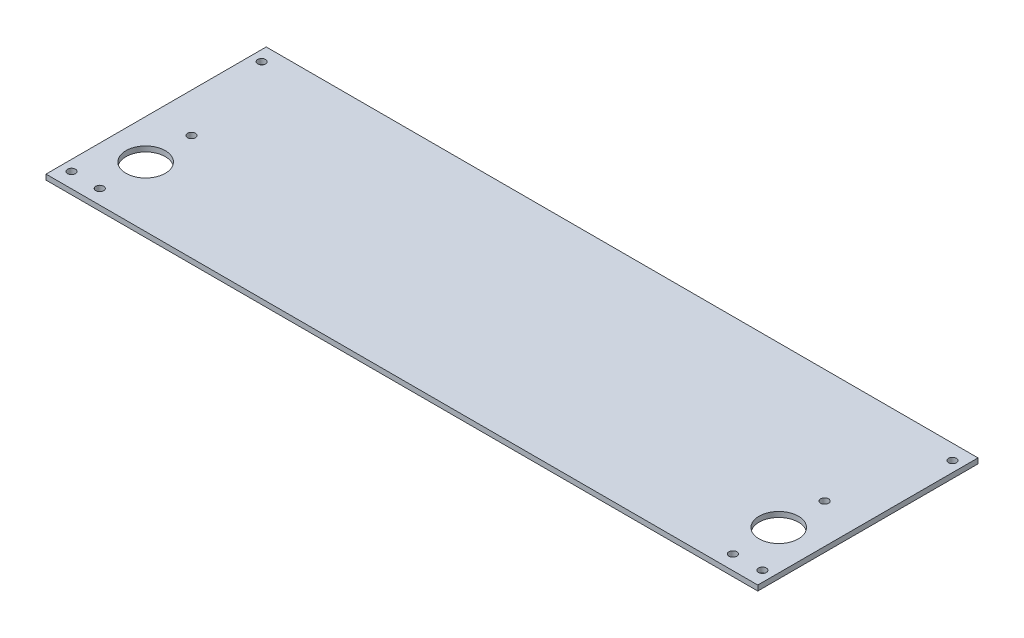
ISO-10303-21;
HEADER;
FILE_DESCRIPTION(('STEP AP214'),'2;1');
FILE_NAME('part.step','',(''),(''),'','','');
FILE_SCHEMA(('AUTOMOTIVE_DESIGN { 1 0 10303 214 1 1 1 1 }'));
ENDSEC;
DATA;
#1=APPLICATION_CONTEXT('core data for automotive mechanical design processes');
#2=APPLICATION_PROTOCOL_DEFINITION('international standard','automotive_design',2000,#1);
#3=PRODUCT_CONTEXT('',#1,'mechanical');
#4=PRODUCT('Part','Part','',(#3));
#5=PRODUCT_RELATED_PRODUCT_CATEGORY('part','',(#4));
#6=PRODUCT_DEFINITION_FORMATION('','',#4);
#7=PRODUCT_DEFINITION_CONTEXT('part definition',#1,'design');
#8=PRODUCT_DEFINITION('design','',#6,#7);
#9=PRODUCT_DEFINITION_SHAPE('','',#8);
#10=(LENGTH_UNIT() NAMED_UNIT(*) SI_UNIT(.MILLI.,.METRE.));
#11=(NAMED_UNIT(*) PLANE_ANGLE_UNIT() SI_UNIT($,.RADIAN.));
#12=(NAMED_UNIT(*) SI_UNIT($,.STERADIAN.) SOLID_ANGLE_UNIT());
#13=UNCERTAINTY_MEASURE_WITH_UNIT(LENGTH_MEASURE(1.E-05),#10,'distance_accuracy_value','');
#14=(GEOMETRIC_REPRESENTATION_CONTEXT(3) GLOBAL_UNCERTAINTY_ASSIGNED_CONTEXT((#13)) GLOBAL_UNIT_ASSIGNED_CONTEXT((#10,
#11,#12)) REPRESENTATION_CONTEXT('',''));
#15=CARTESIAN_POINT('',(0.,0.,0.));
#16=DIRECTION('',(0.,0.,1.));
#17=DIRECTION('',(1.,0.,0.));
#18=AXIS2_PLACEMENT_3D('',#15,#16,#17);
#19=CARTESIAN_POINT('',(0.,2.,0.));
#20=DIRECTION('',(0.,-1.,0.));
#21=DIRECTION('',(0.,0.,-1.));
#22=AXIS2_PLACEMENT_3D('',#19,#20,#21);
#23=PLANE('',#22);
#24=CARTESIAN_POINT('',(256.5,2.,-5.50000000000003));
#25=DIRECTION('',(0.,1.,0.));
#26=DIRECTION('',(0.,0.,-1.));
#27=AXIS2_PLACEMENT_3D('',#24,#25,#26);
#28=CIRCLE('',#27,1.49999999999997);
#29=CARTESIAN_POINT('',(256.5,2.,-7.));
#30=VERTEX_POINT('',#29);
#31=EDGE_CURVE('E325',#30,#30,#28,.T.);
#32=ORIENTED_EDGE('',*,*,#31,.F.);
#33=EDGE_LOOP('',(#32));
#34=FACE_BOUND('',#33,.T.);
#35=CARTESIAN_POINT('',(256.5,2.,-40.5));
#36=DIRECTION('',(0.,1.,0.));
#37=DIRECTION('',(0.,0.,-1.));
#38=AXIS2_PLACEMENT_3D('',#35,#36,#37);
#39=CIRCLE('',#38,1.49999999999997);
#40=CARTESIAN_POINT('',(256.5,2.,-42.));
#41=VERTEX_POINT('',#40);
#42=EDGE_CURVE('E326',#41,#41,#39,.T.);
#43=ORIENTED_EDGE('',*,*,#42,.F.);
#44=EDGE_LOOP('',(#43));
#45=FACE_BOUND('',#44,.T.);
#46=CARTESIAN_POINT('',(256.5,2.,-23.));
#47=DIRECTION('',(0.,1.,0.));
#48=DIRECTION('',(0.,0.,-1.));
#49=AXIS2_PLACEMENT_3D('',#46,#47,#48);
#50=CIRCLE('',#49,7.50000000000001);
#51=CARTESIAN_POINT('',(256.5,2.,-30.5));
#52=VERTEX_POINT('',#51);
#53=EDGE_CURVE('E329',#52,#52,#50,.T.);
#54=ORIENTED_EDGE('',*,*,#53,.F.);
#55=EDGE_LOOP('',(#54));
#56=FACE_BOUND('',#55,.T.);
#57=CARTESIAN_POINT('',(15.,2.,-23.));
#58=DIRECTION('',(0.,1.,0.));
#59=DIRECTION('',(0.,0.,1.));
#60=AXIS2_PLACEMENT_3D('',#57,#58,#59);
#61=CIRCLE('',#60,7.49999999999999);
#62=CARTESIAN_POINT('',(15.,2.,-15.5));
#63=VERTEX_POINT('',#62);
#64=EDGE_CURVE('E337',#63,#63,#61,.T.);
#65=ORIENTED_EDGE('',*,*,#64,.F.);
#66=EDGE_LOOP('',(#65));
#67=FACE_BOUND('',#66,.T.);
#68=CARTESIAN_POINT('',(15.,2.,-40.5));
#69=DIRECTION('',(0.,1.,0.));
#70=DIRECTION('',(0.,0.,1.));
#71=AXIS2_PLACEMENT_3D('',#68,#69,#70);
#72=CIRCLE('',#71,1.5);
#73=CARTESIAN_POINT('',(15.,2.,-39.));
#74=VERTEX_POINT('',#73);
#75=EDGE_CURVE('E333',#74,#74,#72,.T.);
#76=ORIENTED_EDGE('',*,*,#75,.F.);
#77=EDGE_LOOP('',(#76));
#78=FACE_BOUND('',#77,.T.);
#79=CARTESIAN_POINT('',(15.,2.,-5.5));
#80=DIRECTION('',(0.,1.,0.));
#81=DIRECTION('',(0.,0.,1.));
#82=AXIS2_PLACEMENT_3D('',#79,#80,#81);
#83=CIRCLE('',#82,1.5);
#84=CARTESIAN_POINT('',(15.,2.,-4.));
#85=VERTEX_POINT('',#84);
#86=EDGE_CURVE('E117',#85,#85,#83,.T.);
#87=ORIENTED_EDGE('',*,*,#86,.F.);
#88=EDGE_LOOP('',(#87));
#89=FACE_BOUND('',#88,.T.);
#90=DIRECTION('',(0.,0.,1.));
#91=VECTOR('',#90,1.);
#92=CARTESIAN_POINT('',(0.,2.,0.));
#93=LINE('',#92,#91);
#94=CARTESIAN_POINT('',(0.,2.,-84.));
#95=VERTEX_POINT('',#94);
#96=CARTESIAN_POINT('',(0.,2.,0.));
#97=VERTEX_POINT('',#96);
#98=EDGE_CURVE('E91',#95,#97,#93,.T.);
#99=ORIENTED_EDGE('',*,*,#98,.T.);
#100=DIRECTION('',(1.,0.,0.));
#101=VECTOR('',#100,1.);
#102=CARTESIAN_POINT('',(0.,2.,0.));
#103=LINE('',#102,#101);
#104=CARTESIAN_POINT('',(271.5,2.,0.));
#105=VERTEX_POINT('',#104);
#106=EDGE_CURVE('E86',#97,#105,#103,.T.);
#107=ORIENTED_EDGE('',*,*,#106,.T.);
#108=DIRECTION('',(0.,0.,-1.));
#109=VECTOR('',#108,1.);
#110=CARTESIAN_POINT('',(271.5,2.,0.));
#111=LINE('',#110,#109);
#112=CARTESIAN_POINT('',(271.5,2.,-84.));
#113=VERTEX_POINT('',#112);
#114=EDGE_CURVE('E89',#105,#113,#111,.T.);
#115=ORIENTED_EDGE('',*,*,#114,.T.);
#116=DIRECTION('',(-1.,0.,0.));
#117=VECTOR('',#116,1.);
#118=CARTESIAN_POINT('',(0.,2.,-84.));
#119=LINE('',#118,#117);
#120=EDGE_CURVE('E56',#113,#95,#119,.T.);
#121=ORIENTED_EDGE('',*,*,#120,.T.);
#122=EDGE_LOOP('',(#99,#107,#115,#121));
#123=FACE_BOUND('',#122,.T.);
#124=CARTESIAN_POINT('',(4.,2.,-5.75));
#125=DIRECTION('',(0.,1.,0.));
#126=DIRECTION('',(0.,0.,1.));
#127=AXIS2_PLACEMENT_3D('',#124,#125,#126);
#128=CIRCLE('',#127,1.5);
#129=CARTESIAN_POINT('',(4.,2.,-4.25));
#130=VERTEX_POINT('',#129);
#131=EDGE_CURVE('E107',#130,#130,#128,.T.);
#132=ORIENTED_EDGE('',*,*,#131,.F.);
#133=EDGE_LOOP('',(#132));
#134=FACE_BOUND('',#133,.T.);
#135=CARTESIAN_POINT('',(4.,2.,-78.25));
#136=DIRECTION('',(0.,1.,0.));
#137=DIRECTION('',(0.,0.,1.));
#138=AXIS2_PLACEMENT_3D('',#135,#136,#137);
#139=CIRCLE('',#138,1.5);
#140=CARTESIAN_POINT('',(4.,2.,-76.75));
#141=VERTEX_POINT('',#140);
#142=EDGE_CURVE('E149',#141,#141,#139,.T.);
#143=ORIENTED_EDGE('',*,*,#142,.F.);
#144=EDGE_LOOP('',(#143));
#145=FACE_BOUND('',#144,.T.);
#146=CARTESIAN_POINT('',(267.5,2.,-5.75));
#147=DIRECTION('',(0.,1.,0.));
#148=DIRECTION('',(0.,0.,1.));
#149=AXIS2_PLACEMENT_3D('',#146,#147,#148);
#150=CIRCLE('',#149,1.50000000000002);
#151=CARTESIAN_POINT('',(267.5,2.,-4.24999999999998));
#152=VERTEX_POINT('',#151);
#153=EDGE_CURVE('E143',#152,#152,#150,.T.);
#154=ORIENTED_EDGE('',*,*,#153,.F.);
#155=EDGE_LOOP('',(#154));
#156=FACE_BOUND('',#155,.T.);
#157=CARTESIAN_POINT('',(267.5,2.,-78.25));
#158=DIRECTION('',(0.,1.,0.));
#159=DIRECTION('',(0.,0.,1.));
#160=AXIS2_PLACEMENT_3D('',#157,#158,#159);
#161=CIRCLE('',#160,1.50000000000002);
#162=CARTESIAN_POINT('',(267.5,2.,-76.75));
#163=VERTEX_POINT('',#162);
#164=EDGE_CURVE('E134',#163,#163,#161,.T.);
#165=ORIENTED_EDGE('',*,*,#164,.F.);
#166=EDGE_LOOP('',(#165));
#167=FACE_BOUND('',#166,.T.);
#168=ADVANCED_FACE('F37',(#34,#45,#56,#67,#78,#89,#123,#134,#145,#156,#167),#23,.F.);
#169=CARTESIAN_POINT('',(0.,0.,0.));
#170=DIRECTION('',(0.,-1.,0.));
#171=DIRECTION('',(0.,0.,-1.));
#172=AXIS2_PLACEMENT_3D('',#169,#170,#171);
#173=PLANE('',#172);
#174=CARTESIAN_POINT('',(256.5,0.,-5.50000000000003));
#175=DIRECTION('',(0.,-1.,0.));
#176=DIRECTION('',(0.,0.,-1.));
#177=AXIS2_PLACEMENT_3D('',#174,#175,#176);
#178=CIRCLE('',#177,1.49999999999997);
#179=CARTESIAN_POINT('',(256.5,0.,-7.));
#180=VERTEX_POINT('',#179);
#181=EDGE_CURVE('E41',#180,#180,#178,.T.);
#182=ORIENTED_EDGE('',*,*,#181,.F.);
#183=EDGE_LOOP('',(#182));
#184=FACE_BOUND('',#183,.T.);
#185=CARTESIAN_POINT('',(256.5,0.,-40.5));
#186=DIRECTION('',(0.,-1.,0.));
#187=DIRECTION('',(0.,0.,-1.));
#188=AXIS2_PLACEMENT_3D('',#185,#186,#187);
#189=CIRCLE('',#188,1.49999999999997);
#190=CARTESIAN_POINT('',(256.5,0.,-42.));
#191=VERTEX_POINT('',#190);
#192=EDGE_CURVE('E125',#191,#191,#189,.T.);
#193=ORIENTED_EDGE('',*,*,#192,.F.);
#194=EDGE_LOOP('',(#193));
#195=FACE_BOUND('',#194,.T.);
#196=CARTESIAN_POINT('',(256.5,0.,-23.));
#197=DIRECTION('',(0.,-1.,0.));
#198=DIRECTION('',(0.,0.,-1.));
#199=AXIS2_PLACEMENT_3D('',#196,#197,#198);
#200=CIRCLE('',#199,7.50000000000001);
#201=CARTESIAN_POINT('',(256.5,0.,-30.5));
#202=VERTEX_POINT('',#201);
#203=EDGE_CURVE('E123',#202,#202,#200,.T.);
#204=ORIENTED_EDGE('',*,*,#203,.F.);
#205=EDGE_LOOP('',(#204));
#206=FACE_BOUND('',#205,.T.);
#207=CARTESIAN_POINT('',(15.,0.,-23.));
#208=DIRECTION('',(0.,-1.,0.));
#209=DIRECTION('',(0.,0.,-1.));
#210=AXIS2_PLACEMENT_3D('',#207,#208,#209);
#211=CIRCLE('',#210,7.49999999999999);
#212=CARTESIAN_POINT('',(15.,0.,-30.5));
#213=VERTEX_POINT('',#212);
#214=EDGE_CURVE('E120',#213,#213,#211,.T.);
#215=ORIENTED_EDGE('',*,*,#214,.F.);
#216=EDGE_LOOP('',(#215));
#217=FACE_BOUND('',#216,.T.);
#218=CARTESIAN_POINT('',(15.,0.,-40.5));
#219=DIRECTION('',(0.,-1.,0.));
#220=DIRECTION('',(0.,0.,-1.));
#221=AXIS2_PLACEMENT_3D('',#218,#219,#220);
#222=CIRCLE('',#221,1.5);
#223=CARTESIAN_POINT('',(15.,0.,-42.));
#224=VERTEX_POINT('',#223);
#225=EDGE_CURVE('E116',#224,#224,#222,.T.);
#226=ORIENTED_EDGE('',*,*,#225,.F.);
#227=EDGE_LOOP('',(#226));
#228=FACE_BOUND('',#227,.T.);
#229=CARTESIAN_POINT('',(15.,0.,-5.5));
#230=DIRECTION('',(0.,-1.,0.));
#231=DIRECTION('',(0.,0.,-1.));
#232=AXIS2_PLACEMENT_3D('',#229,#230,#231);
#233=CIRCLE('',#232,1.5);
#234=CARTESIAN_POINT('',(15.,0.,-7.));
#235=VERTEX_POINT('',#234);
#236=EDGE_CURVE('E113',#235,#235,#233,.T.);
#237=ORIENTED_EDGE('',*,*,#236,.F.);
#238=EDGE_LOOP('',(#237));
#239=FACE_BOUND('',#238,.T.);
#240=CARTESIAN_POINT('',(267.5,0.,-5.75));
#241=DIRECTION('',(0.,1.,0.));
#242=DIRECTION('',(0.,0.,1.));
#243=AXIS2_PLACEMENT_3D('',#240,#241,#242);
#244=CIRCLE('',#243,1.50000000000002);
#245=CARTESIAN_POINT('',(267.5,0.,-4.24999999999998));
#246=VERTEX_POINT('',#245);
#247=EDGE_CURVE('E139',#246,#246,#244,.T.);
#248=ORIENTED_EDGE('',*,*,#247,.T.);
#249=EDGE_LOOP('',(#248));
#250=FACE_BOUND('',#249,.T.);
#251=CARTESIAN_POINT('',(4.,0.,-5.75));
#252=DIRECTION('',(0.,1.,0.));
#253=DIRECTION('',(0.,0.,1.));
#254=AXIS2_PLACEMENT_3D('',#251,#252,#253);
#255=CIRCLE('',#254,1.5);
#256=CARTESIAN_POINT('',(4.,0.,-4.25));
#257=VERTEX_POINT('',#256);
#258=EDGE_CURVE('E152',#257,#257,#255,.T.);
#259=ORIENTED_EDGE('',*,*,#258,.T.);
#260=EDGE_LOOP('',(#259));
#261=FACE_BOUND('',#260,.T.);
#262=DIRECTION('',(0.,0.,1.));
#263=VECTOR('',#262,1.);
#264=CARTESIAN_POINT('',(0.,0.,0.));
#265=LINE('',#264,#263);
#266=CARTESIAN_POINT('',(0.,0.,-84.));
#267=VERTEX_POINT('',#266);
#268=CARTESIAN_POINT('',(0.,0.,0.));
#269=VERTEX_POINT('',#268);
#270=EDGE_CURVE('E104',#267,#269,#265,.T.);
#271=ORIENTED_EDGE('',*,*,#270,.F.);
#272=DIRECTION('',(-1.,0.,0.));
#273=VECTOR('',#272,1.);
#274=CARTESIAN_POINT('',(0.,0.,-84.));
#275=LINE('',#274,#273);
#276=CARTESIAN_POINT('',(271.5,0.,-84.));
#277=VERTEX_POINT('',#276);
#278=EDGE_CURVE('E79',#277,#267,#275,.T.);
#279=ORIENTED_EDGE('',*,*,#278,.F.);
#280=DIRECTION('',(0.,0.,-1.));
#281=VECTOR('',#280,1.);
#282=CARTESIAN_POINT('',(271.5,0.,0.));
#283=LINE('',#282,#281);
#284=CARTESIAN_POINT('',(271.5,0.,0.));
#285=VERTEX_POINT('',#284);
#286=EDGE_CURVE('E73',#285,#277,#283,.T.);
#287=ORIENTED_EDGE('',*,*,#286,.F.);
#288=DIRECTION('',(1.,0.,0.));
#289=VECTOR('',#288,1.);
#290=CARTESIAN_POINT('',(0.,0.,0.));
#291=LINE('',#290,#289);
#292=EDGE_CURVE('E95',#269,#285,#291,.T.);
#293=ORIENTED_EDGE('',*,*,#292,.F.);
#294=EDGE_LOOP('',(#271,#279,#287,#293));
#295=FACE_BOUND('',#294,.T.);
#296=CARTESIAN_POINT('',(4.,0.,-78.25));
#297=DIRECTION('',(0.,1.,0.));
#298=DIRECTION('',(0.,0.,1.));
#299=AXIS2_PLACEMENT_3D('',#296,#297,#298);
#300=CIRCLE('',#299,1.5);
#301=CARTESIAN_POINT('',(4.,0.,-76.75));
#302=VERTEX_POINT('',#301);
#303=EDGE_CURVE('E146',#302,#302,#300,.T.);
#304=ORIENTED_EDGE('',*,*,#303,.T.);
#305=EDGE_LOOP('',(#304));
#306=FACE_BOUND('',#305,.T.);
#307=CARTESIAN_POINT('',(267.5,0.,-78.25));
#308=DIRECTION('',(0.,1.,0.));
#309=DIRECTION('',(0.,0.,1.));
#310=AXIS2_PLACEMENT_3D('',#307,#308,#309);
#311=CIRCLE('',#310,1.50000000000002);
#312=CARTESIAN_POINT('',(267.5,0.,-76.75));
#313=VERTEX_POINT('',#312);
#314=EDGE_CURVE('E130',#313,#313,#311,.T.);
#315=ORIENTED_EDGE('',*,*,#314,.T.);
#316=EDGE_LOOP('',(#315));
#317=FACE_BOUND('',#316,.T.);
#318=ADVANCED_FACE('F160',(#184,#195,#206,#217,#228,#239,#250,#261,#295,#306,#317),#173,.T.);
#319=CARTESIAN_POINT('',(0.,2.,0.));
#320=DIRECTION('',(1.,0.,0.));
#321=DIRECTION('',(0.,0.,-1.));
#322=AXIS2_PLACEMENT_3D('',#319,#320,#321);
#323=PLANE('',#322);
#324=ORIENTED_EDGE('',*,*,#270,.T.);
#325=DIRECTION('',(0.,-1.,0.));
#326=VECTOR('',#325,1.);
#327=CARTESIAN_POINT('',(0.,2.,0.));
#328=LINE('',#327,#326);
#329=EDGE_CURVE('E11',#97,#269,#328,.T.);
#330=ORIENTED_EDGE('',*,*,#329,.F.);
#331=ORIENTED_EDGE('',*,*,#98,.F.);
#332=DIRECTION('',(0.,-1.,0.));
#333=VECTOR('',#332,1.);
#334=CARTESIAN_POINT('',(0.,2.,-84.));
#335=LINE('',#334,#333);
#336=EDGE_CURVE('E100',#95,#267,#335,.T.);
#337=ORIENTED_EDGE('',*,*,#336,.T.);
#338=EDGE_LOOP('',(#324,#330,#331,#337));
#339=FACE_BOUND('',#338,.T.);
#340=ADVANCED_FACE('F39',(#339),#323,.F.);
#341=CARTESIAN_POINT('',(0.,2.,0.));
#342=DIRECTION('',(0.,0.,-1.));
#343=DIRECTION('',(-1.,0.,0.));
#344=AXIS2_PLACEMENT_3D('',#341,#342,#343);
#345=PLANE('',#344);
#346=ORIENTED_EDGE('',*,*,#292,.T.);
#347=DIRECTION('',(0.,-1.,0.));
#348=VECTOR('',#347,1.);
#349=CARTESIAN_POINT('',(271.5,2.,0.));
#350=LINE('',#349,#348);
#351=EDGE_CURVE('E47',#105,#285,#350,.T.);
#352=ORIENTED_EDGE('',*,*,#351,.F.);
#353=ORIENTED_EDGE('',*,*,#106,.F.);
#354=ORIENTED_EDGE('',*,*,#329,.T.);
#355=EDGE_LOOP('',(#346,#352,#353,#354));
#356=FACE_BOUND('',#355,.T.);
#357=ADVANCED_FACE('F94',(#356),#345,.F.);
#358=CARTESIAN_POINT('',(271.5,2.,0.));
#359=DIRECTION('',(-1.,0.,0.));
#360=DIRECTION('',(0.,0.,1.));
#361=AXIS2_PLACEMENT_3D('',#358,#359,#360);
#362=PLANE('',#361);
#363=ORIENTED_EDGE('',*,*,#286,.T.);
#364=DIRECTION('',(0.,-1.,0.));
#365=VECTOR('',#364,1.);
#366=CARTESIAN_POINT('',(271.5,2.,-84.));
#367=LINE('',#366,#365);
#368=EDGE_CURVE('E96',#113,#277,#367,.T.);
#369=ORIENTED_EDGE('',*,*,#368,.F.);
#370=ORIENTED_EDGE('',*,*,#114,.F.);
#371=ORIENTED_EDGE('',*,*,#351,.T.);
#372=EDGE_LOOP('',(#363,#369,#370,#371));
#373=FACE_BOUND('',#372,.T.);
#374=ADVANCED_FACE('F98',(#373),#362,.F.);
#375=CARTESIAN_POINT('',(0.,2.,-84.));
#376=DIRECTION('',(0.,0.,1.));
#377=DIRECTION('',(1.,0.,0.));
#378=AXIS2_PLACEMENT_3D('',#375,#376,#377);
#379=PLANE('',#378);
#380=ORIENTED_EDGE('',*,*,#278,.T.);
#381=ORIENTED_EDGE('',*,*,#336,.F.);
#382=ORIENTED_EDGE('',*,*,#120,.F.);
#383=ORIENTED_EDGE('',*,*,#368,.T.);
#384=EDGE_LOOP('',(#380,#381,#382,#383));
#385=FACE_BOUND('',#384,.T.);
#386=ADVANCED_FACE('F166',(#385),#379,.F.);
#387=CARTESIAN_POINT('',(4.,2.,-5.75));
#388=DIRECTION('',(0.,-1.,0.));
#389=DIRECTION('',(0.,0.,-1.));
#390=AXIS2_PLACEMENT_3D('',#387,#388,#389);
#391=CYLINDRICAL_SURFACE('',#390,1.5);
#392=ORIENTED_EDGE('',*,*,#131,.T.);
#393=EDGE_LOOP('',(#392));
#394=FACE_BOUND('',#393,.T.);
#395=ORIENTED_EDGE('',*,*,#258,.F.);
#396=EDGE_LOOP('',(#395));
#397=FACE_BOUND('',#396,.T.);
#398=ADVANCED_FACE('F163',(#394,#397),#391,.F.);
#399=CARTESIAN_POINT('',(4.,2.,-78.25));
#400=DIRECTION('',(0.,-1.,0.));
#401=DIRECTION('',(0.,0.,-1.));
#402=AXIS2_PLACEMENT_3D('',#399,#400,#401);
#403=CYLINDRICAL_SURFACE('',#402,1.5);
#404=ORIENTED_EDGE('',*,*,#142,.T.);
#405=EDGE_LOOP('',(#404));
#406=FACE_BOUND('',#405,.T.);
#407=ORIENTED_EDGE('',*,*,#303,.F.);
#408=EDGE_LOOP('',(#407));
#409=FACE_BOUND('',#408,.T.);
#410=ADVANCED_FACE('F165',(#406,#409),#403,.F.);
#411=CARTESIAN_POINT('',(267.5,2.,-5.75));
#412=DIRECTION('',(0.,-1.,0.));
#413=DIRECTION('',(0.,0.,-1.));
#414=AXIS2_PLACEMENT_3D('',#411,#412,#413);
#415=CYLINDRICAL_SURFACE('',#414,1.50000000000002);
#416=ORIENTED_EDGE('',*,*,#153,.T.);
#417=EDGE_LOOP('',(#416));
#418=FACE_BOUND('',#417,.T.);
#419=ORIENTED_EDGE('',*,*,#247,.F.);
#420=EDGE_LOOP('',(#419));
#421=FACE_BOUND('',#420,.T.);
#422=ADVANCED_FACE('F173',(#418,#421),#415,.F.);
#423=CARTESIAN_POINT('',(267.5,2.,-78.25));
#424=DIRECTION('',(0.,-1.,0.));
#425=DIRECTION('',(0.,0.,-1.));
#426=AXIS2_PLACEMENT_3D('',#423,#424,#425);
#427=CYLINDRICAL_SURFACE('',#426,1.50000000000002);
#428=ORIENTED_EDGE('',*,*,#164,.T.);
#429=EDGE_LOOP('',(#428));
#430=FACE_BOUND('',#429,.T.);
#431=ORIENTED_EDGE('',*,*,#314,.F.);
#432=EDGE_LOOP('',(#431));
#433=FACE_BOUND('',#432,.T.);
#434=ADVANCED_FACE('F218',(#430,#433),#427,.F.);
#435=CARTESIAN_POINT('',(15.,-8.,-5.5));
#436=DIRECTION('',(0.,1.,0.));
#437=DIRECTION('',(0.,0.,1.));
#438=AXIS2_PLACEMENT_3D('',#435,#436,#437);
#439=CYLINDRICAL_SURFACE('',#438,1.5);
#440=ORIENTED_EDGE('',*,*,#236,.T.);
#441=EDGE_LOOP('',(#440));
#442=FACE_BOUND('',#441,.T.);
#443=ORIENTED_EDGE('',*,*,#86,.T.);
#444=EDGE_LOOP('',(#443));
#445=FACE_BOUND('',#444,.T.);
#446=ADVANCED_FACE('F212',(#442,#445),#439,.F.);
#447=CARTESIAN_POINT('',(15.,-8.,-40.5));
#448=DIRECTION('',(0.,1.,0.));
#449=DIRECTION('',(0.,0.,1.));
#450=AXIS2_PLACEMENT_3D('',#447,#448,#449);
#451=CYLINDRICAL_SURFACE('',#450,1.5);
#452=ORIENTED_EDGE('',*,*,#225,.T.);
#453=EDGE_LOOP('',(#452));
#454=FACE_BOUND('',#453,.T.);
#455=ORIENTED_EDGE('',*,*,#75,.T.);
#456=EDGE_LOOP('',(#455));
#457=FACE_BOUND('',#456,.T.);
#458=ADVANCED_FACE('F217',(#454,#457),#451,.F.);
#459=CARTESIAN_POINT('',(15.,-8.,-23.));
#460=DIRECTION('',(0.,1.,0.));
#461=DIRECTION('',(0.,0.,1.));
#462=AXIS2_PLACEMENT_3D('',#459,#460,#461);
#463=CYLINDRICAL_SURFACE('',#462,7.49999999999999);
#464=ORIENTED_EDGE('',*,*,#214,.T.);
#465=EDGE_LOOP('',(#464));
#466=FACE_BOUND('',#465,.T.);
#467=ORIENTED_EDGE('',*,*,#64,.T.);
#468=EDGE_LOOP('',(#467));
#469=FACE_BOUND('',#468,.T.);
#470=ADVANCED_FACE('F230',(#466,#469),#463,.F.);
#471=CARTESIAN_POINT('',(256.5,-8.,-23.));
#472=DIRECTION('',(0.,1.,0.));
#473=DIRECTION('',(0.,0.,1.));
#474=AXIS2_PLACEMENT_3D('',#471,#472,#473);
#475=CYLINDRICAL_SURFACE('',#474,7.50000000000001);
#476=ORIENTED_EDGE('',*,*,#203,.T.);
#477=EDGE_LOOP('',(#476));
#478=FACE_BOUND('',#477,.T.);
#479=ORIENTED_EDGE('',*,*,#53,.T.);
#480=EDGE_LOOP('',(#479));
#481=FACE_BOUND('',#480,.T.);
#482=ADVANCED_FACE('F240',(#478,#481),#475,.F.);
#483=CARTESIAN_POINT('',(256.5,-8.,-40.5));
#484=DIRECTION('',(0.,1.,0.));
#485=DIRECTION('',(0.,0.,1.));
#486=AXIS2_PLACEMENT_3D('',#483,#484,#485);
#487=CYLINDRICAL_SURFACE('',#486,1.49999999999997);
#488=ORIENTED_EDGE('',*,*,#192,.T.);
#489=EDGE_LOOP('',(#488));
#490=FACE_BOUND('',#489,.T.);
#491=ORIENTED_EDGE('',*,*,#42,.T.);
#492=EDGE_LOOP('',(#491));
#493=FACE_BOUND('',#492,.T.);
#494=ADVANCED_FACE('F250',(#490,#493),#487,.F.);
#495=CARTESIAN_POINT('',(256.5,-8.,-5.50000000000003));
#496=DIRECTION('',(0.,1.,0.));
#497=DIRECTION('',(0.,0.,1.));
#498=AXIS2_PLACEMENT_3D('',#495,#496,#497);
#499=CYLINDRICAL_SURFACE('',#498,1.49999999999997);
#500=ORIENTED_EDGE('',*,*,#181,.T.);
#501=EDGE_LOOP('',(#500));
#502=FACE_BOUND('',#501,.T.);
#503=ORIENTED_EDGE('',*,*,#31,.T.);
#504=EDGE_LOOP('',(#503));
#505=FACE_BOUND('',#504,.T.);
#506=ADVANCED_FACE('F260',(#502,#505),#499,.F.);
#507=CLOSED_SHELL('',(#168,#318,#340,#357,#374,#386,#398,#410,#422,#434,#446,#458,#470,#482,
#494,#506));
#508=MANIFOLD_SOLID_BREP('B2',#507);
#509=ADVANCED_BREP_SHAPE_REPRESENTATION('',(#18,#508),#14);
#510=SHAPE_DEFINITION_REPRESENTATION(#9,#509);
ENDSEC;
END-ISO-10303-21;
